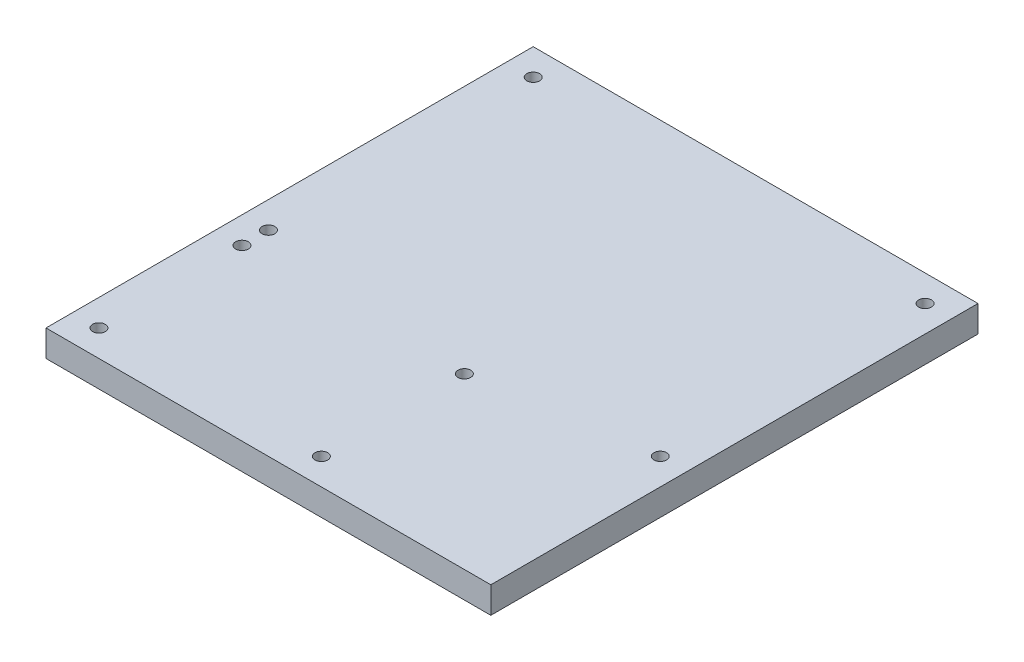
ISO-10303-21;
HEADER;
FILE_DESCRIPTION(('STEP AP214'),'2;1');
FILE_NAME('part.step','',(''),(''),'','','');
FILE_SCHEMA(('AUTOMOTIVE_DESIGN { 1 0 10303 214 1 1 1 1 }'));
ENDSEC;
DATA;
#1=APPLICATION_CONTEXT('core data for automotive mechanical design processes');
#2=APPLICATION_PROTOCOL_DEFINITION('international standard','automotive_design',2000,#1);
#3=PRODUCT_CONTEXT('',#1,'mechanical');
#4=PRODUCT('Part','Part','',(#3));
#5=PRODUCT_RELATED_PRODUCT_CATEGORY('part','',(#4));
#6=PRODUCT_DEFINITION_FORMATION('','',#4);
#7=PRODUCT_DEFINITION_CONTEXT('part definition',#1,'design');
#8=PRODUCT_DEFINITION('design','',#6,#7);
#9=PRODUCT_DEFINITION_SHAPE('','',#8);
#10=(LENGTH_UNIT() NAMED_UNIT(*) SI_UNIT(.MILLI.,.METRE.));
#11=(NAMED_UNIT(*) PLANE_ANGLE_UNIT() SI_UNIT($,.RADIAN.));
#12=(NAMED_UNIT(*) SI_UNIT($,.STERADIAN.) SOLID_ANGLE_UNIT());
#13=UNCERTAINTY_MEASURE_WITH_UNIT(LENGTH_MEASURE(1.E-05),#10,'distance_accuracy_value','');
#14=(GEOMETRIC_REPRESENTATION_CONTEXT(3) GLOBAL_UNCERTAINTY_ASSIGNED_CONTEXT((#13)) GLOBAL_UNIT_ASSIGNED_CONTEXT((#10,
#11,#12)) REPRESENTATION_CONTEXT('',''));
#15=CARTESIAN_POINT('',(0.,0.,0.));
#16=DIRECTION('',(0.,0.,1.));
#17=DIRECTION('',(1.,0.,0.));
#18=AXIS2_PLACEMENT_3D('',#15,#16,#17);
#19=CARTESIAN_POINT('',(42.,5.,-46.));
#20=DIRECTION('',(-1.,0.,0.));
#21=DIRECTION('',(0.,0.,1.));
#22=AXIS2_PLACEMENT_3D('',#19,#20,#21);
#23=PLANE('',#22);
#24=DIRECTION('',(0.,0.,-1.));
#25=VECTOR('',#24,1.);
#26=CARTESIAN_POINT('',(42.,0.,-46.));
#27=LINE('',#26,#25);
#28=CARTESIAN_POINT('',(42.,0.,46.));
#29=VERTEX_POINT('',#28);
#30=CARTESIAN_POINT('',(42.,0.,-46.));
#31=VERTEX_POINT('',#30);
#32=EDGE_CURVE('E265',#29,#31,#27,.T.);
#33=ORIENTED_EDGE('',*,*,#32,.T.);
#34=DIRECTION('',(0.,-1.,0.));
#35=VECTOR('',#34,1.);
#36=CARTESIAN_POINT('',(42.,5.,-46.));
#37=LINE('',#36,#35);
#38=CARTESIAN_POINT('',(42.,5.,-46.));
#39=VERTEX_POINT('',#38);
#40=EDGE_CURVE('E12',#39,#31,#37,.T.);
#41=ORIENTED_EDGE('',*,*,#40,.F.);
#42=DIRECTION('',(0.,0.,-1.));
#43=VECTOR('',#42,1.);
#44=CARTESIAN_POINT('',(42.,5.,-46.));
#45=LINE('',#44,#43);
#46=CARTESIAN_POINT('',(42.,5.,46.));
#47=VERTEX_POINT('',#46);
#48=EDGE_CURVE('E276',#47,#39,#45,.T.);
#49=ORIENTED_EDGE('',*,*,#48,.F.);
#50=DIRECTION('',(0.,-1.,0.));
#51=VECTOR('',#50,1.);
#52=CARTESIAN_POINT('',(42.,5.,46.));
#53=LINE('',#52,#51);
#54=EDGE_CURVE('E286',#47,#29,#53,.T.);
#55=ORIENTED_EDGE('',*,*,#54,.T.);
#56=EDGE_LOOP('',(#33,#41,#49,#55));
#57=FACE_BOUND('',#56,.T.);
#58=ADVANCED_FACE('F59',(#57),#23,.F.);
#59=CARTESIAN_POINT('',(-42.,5.,-46.));
#60=DIRECTION('',(0.,0.,1.));
#61=DIRECTION('',(1.,0.,0.));
#62=AXIS2_PLACEMENT_3D('',#59,#60,#61);
#63=PLANE('',#62);
#64=DIRECTION('',(-1.,0.,0.));
#65=VECTOR('',#64,1.);
#66=CARTESIAN_POINT('',(-42.,0.,-46.));
#67=LINE('',#66,#65);
#68=CARTESIAN_POINT('',(-42.,0.,-46.));
#69=VERTEX_POINT('',#68);
#70=EDGE_CURVE('E289',#31,#69,#67,.T.);
#71=ORIENTED_EDGE('',*,*,#70,.T.);
#72=DIRECTION('',(0.,-1.,0.));
#73=VECTOR('',#72,1.);
#74=CARTESIAN_POINT('',(-42.,5.,-46.));
#75=LINE('',#74,#73);
#76=CARTESIAN_POINT('',(-42.,5.,-46.));
#77=VERTEX_POINT('',#76);
#78=EDGE_CURVE('E67',#77,#69,#75,.T.);
#79=ORIENTED_EDGE('',*,*,#78,.F.);
#80=DIRECTION('',(-1.,0.,0.));
#81=VECTOR('',#80,1.);
#82=CARTESIAN_POINT('',(-42.,5.,-46.));
#83=LINE('',#82,#81);
#84=EDGE_CURVE('E279',#39,#77,#83,.T.);
#85=ORIENTED_EDGE('',*,*,#84,.F.);
#86=ORIENTED_EDGE('',*,*,#40,.T.);
#87=EDGE_LOOP('',(#71,#79,#85,#86));
#88=FACE_BOUND('',#87,.T.);
#89=ADVANCED_FACE('F381',(#88),#63,.F.);
#90=CARTESIAN_POINT('',(-42.,5.,-46.));
#91=DIRECTION('',(1.,0.,0.));
#92=DIRECTION('',(0.,0.,-1.));
#93=AXIS2_PLACEMENT_3D('',#90,#91,#92);
#94=PLANE('',#93);
#95=DIRECTION('',(0.,0.,1.));
#96=VECTOR('',#95,1.);
#97=CARTESIAN_POINT('',(-42.,0.,-46.));
#98=LINE('',#97,#96);
#99=CARTESIAN_POINT('',(-42.,0.,46.));
#100=VERTEX_POINT('',#99);
#101=EDGE_CURVE('E291',#69,#100,#98,.T.);
#102=ORIENTED_EDGE('',*,*,#101,.T.);
#103=DIRECTION('',(0.,-1.,0.));
#104=VECTOR('',#103,1.);
#105=CARTESIAN_POINT('',(-42.,5.,46.));
#106=LINE('',#105,#104);
#107=CARTESIAN_POINT('',(-42.,5.,46.));
#108=VERTEX_POINT('',#107);
#109=EDGE_CURVE('E296',#108,#100,#106,.T.);
#110=ORIENTED_EDGE('',*,*,#109,.F.);
#111=DIRECTION('',(0.,0.,1.));
#112=VECTOR('',#111,1.);
#113=CARTESIAN_POINT('',(-42.,5.,-46.));
#114=LINE('',#113,#112);
#115=EDGE_CURVE('E282',#77,#108,#114,.T.);
#116=ORIENTED_EDGE('',*,*,#115,.F.);
#117=ORIENTED_EDGE('',*,*,#78,.T.);
#118=EDGE_LOOP('',(#102,#110,#116,#117));
#119=FACE_BOUND('',#118,.T.);
#120=ADVANCED_FACE('F386',(#119),#94,.F.);
#121=CARTESIAN_POINT('',(-42.,5.,46.));
#122=DIRECTION('',(0.,0.,-1.));
#123=DIRECTION('',(-1.,0.,0.));
#124=AXIS2_PLACEMENT_3D('',#121,#122,#123);
#125=PLANE('',#124);
#126=DIRECTION('',(1.,0.,0.));
#127=VECTOR('',#126,1.);
#128=CARTESIAN_POINT('',(-42.,0.,46.));
#129=LINE('',#128,#127);
#130=EDGE_CURVE('E280',#100,#29,#129,.T.);
#131=ORIENTED_EDGE('',*,*,#130,.T.);
#132=ORIENTED_EDGE('',*,*,#54,.F.);
#133=DIRECTION('',(1.,0.,0.));
#134=VECTOR('',#133,1.);
#135=CARTESIAN_POINT('',(-42.,5.,46.));
#136=LINE('',#135,#134);
#137=EDGE_CURVE('E284',#108,#47,#136,.T.);
#138=ORIENTED_EDGE('',*,*,#137,.F.);
#139=ORIENTED_EDGE('',*,*,#109,.T.);
#140=EDGE_LOOP('',(#131,#132,#138,#139));
#141=FACE_BOUND('',#140,.T.);
#142=ADVANCED_FACE('F358',(#141),#125,.F.);
#143=CARTESIAN_POINT('',(0.,5.,0.));
#144=DIRECTION('',(0.,1.,0.));
#145=DIRECTION('',(0.,0.,1.));
#146=AXIS2_PLACEMENT_3D('',#143,#144,#145);
#147=PLANE('',#146);
#148=CARTESIAN_POINT('',(4.99999999999999,5.,14.));
#149=DIRECTION('',(0.,1.,0.));
#150=DIRECTION('',(0.,0.,1.));
#151=AXIS2_PLACEMENT_3D('',#148,#149,#150);
#152=CIRCLE('',#151,1.2);
#153=CARTESIAN_POINT('',(4.99999999999999,5.,15.2));
#154=VERTEX_POINT('',#153);
#155=EDGE_CURVE('E308',#154,#154,#152,.T.);
#156=ORIENTED_EDGE('',*,*,#155,.F.);
#157=EDGE_LOOP('',(#156));
#158=FACE_BOUND('',#157,.T.);
#159=CARTESIAN_POINT('',(-37.,5.,41.));
#160=DIRECTION('',(0.,1.,0.));
#161=DIRECTION('',(0.,0.,1.));
#162=AXIS2_PLACEMENT_3D('',#159,#160,#161);
#163=CIRCLE('',#162,1.2);
#164=CARTESIAN_POINT('',(-37.,5.,42.2));
#165=VERTEX_POINT('',#164);
#166=EDGE_CURVE('E345',#165,#165,#163,.T.);
#167=ORIENTED_EDGE('',*,*,#166,.F.);
#168=EDGE_LOOP('',(#167));
#169=FACE_BOUND('',#168,.T.);
#170=CARTESIAN_POINT('',(4.99999999999999,5.,41.));
#171=DIRECTION('',(0.,1.,0.));
#172=DIRECTION('',(0.,0.,1.));
#173=AXIS2_PLACEMENT_3D('',#170,#171,#172);
#174=CIRCLE('',#173,1.2);
#175=CARTESIAN_POINT('',(4.99999999999999,5.,42.2));
#176=VERTEX_POINT('',#175);
#177=EDGE_CURVE('E342',#176,#176,#174,.T.);
#178=ORIENTED_EDGE('',*,*,#177,.F.);
#179=EDGE_LOOP('',(#178));
#180=FACE_BOUND('',#179,.T.);
#181=CARTESIAN_POINT('',(37.,5.,8.99999999999999));
#182=DIRECTION('',(0.,1.,0.));
#183=DIRECTION('',(0.,0.,1.));
#184=AXIS2_PLACEMENT_3D('',#181,#182,#183);
#185=CIRCLE('',#184,1.2);
#186=CARTESIAN_POINT('',(37.,5.,10.2));
#187=VERTEX_POINT('',#186);
#188=EDGE_CURVE('E339',#187,#187,#185,.T.);
#189=ORIENTED_EDGE('',*,*,#188,.F.);
#190=EDGE_LOOP('',(#189));
#191=FACE_BOUND('',#190,.T.);
#192=CARTESIAN_POINT('',(-37.,5.,9.));
#193=DIRECTION('',(0.,1.,0.));
#194=DIRECTION('',(0.,0.,1.));
#195=AXIS2_PLACEMENT_3D('',#192,#193,#194);
#196=CIRCLE('',#195,1.2);
#197=CARTESIAN_POINT('',(-37.,5.,10.2));
#198=VERTEX_POINT('',#197);
#199=EDGE_CURVE('E336',#198,#198,#196,.T.);
#200=ORIENTED_EDGE('',*,*,#199,.F.);
#201=EDGE_LOOP('',(#200));
#202=FACE_BOUND('',#201,.T.);
#203=CARTESIAN_POINT('',(-37.,5.,-41.));
#204=DIRECTION('',(0.,1.,0.));
#205=DIRECTION('',(0.,0.,1.));
#206=AXIS2_PLACEMENT_3D('',#203,#204,#205);
#207=CIRCLE('',#206,1.2);
#208=CARTESIAN_POINT('',(-37.,5.,-39.8));
#209=VERTEX_POINT('',#208);
#210=EDGE_CURVE('E333',#209,#209,#207,.T.);
#211=ORIENTED_EDGE('',*,*,#210,.F.);
#212=EDGE_LOOP('',(#211));
#213=FACE_BOUND('',#212,.T.);
#214=CARTESIAN_POINT('',(37.,5.,-41.));
#215=DIRECTION('',(0.,1.,0.));
#216=DIRECTION('',(0.,0.,1.));
#217=AXIS2_PLACEMENT_3D('',#214,#215,#216);
#218=CIRCLE('',#217,1.2);
#219=CARTESIAN_POINT('',(37.,5.,-39.8));
#220=VERTEX_POINT('',#219);
#221=EDGE_CURVE('E330',#220,#220,#218,.T.);
#222=ORIENTED_EDGE('',*,*,#221,.F.);
#223=EDGE_LOOP('',(#222));
#224=FACE_BOUND('',#223,.T.);
#225=CARTESIAN_POINT('',(-37.,5.,14.));
#226=DIRECTION('',(0.,1.,0.));
#227=DIRECTION('',(0.,0.,1.));
#228=AXIS2_PLACEMENT_3D('',#225,#226,#227);
#229=CIRCLE('',#228,1.2);
#230=CARTESIAN_POINT('',(-37.,5.,15.2));
#231=VERTEX_POINT('',#230);
#232=EDGE_CURVE('E303',#231,#231,#229,.T.);
#233=ORIENTED_EDGE('',*,*,#232,.F.);
#234=EDGE_LOOP('',(#233));
#235=FACE_BOUND('',#234,.T.);
#236=ORIENTED_EDGE('',*,*,#48,.T.);
#237=ORIENTED_EDGE('',*,*,#84,.T.);
#238=ORIENTED_EDGE('',*,*,#115,.T.);
#239=ORIENTED_EDGE('',*,*,#137,.T.);
#240=EDGE_LOOP('',(#236,#237,#238,#239));
#241=FACE_BOUND('',#240,.T.);
#242=ADVANCED_FACE('F354',(#158,#169,#180,#191,#202,#213,#224,#235,#241),#147,.T.);
#243=CARTESIAN_POINT('',(0.,0.,0.));
#244=DIRECTION('',(0.,1.,0.));
#245=DIRECTION('',(0.,0.,1.));
#246=AXIS2_PLACEMENT_3D('',#243,#244,#245);
#247=PLANE('',#246);
#248=CARTESIAN_POINT('',(4.99999999999999,0.,14.));
#249=DIRECTION('',(0.,1.,0.));
#250=DIRECTION('',(0.,0.,1.));
#251=AXIS2_PLACEMENT_3D('',#248,#249,#250);
#252=CIRCLE('',#251,1.2);
#253=CARTESIAN_POINT('',(4.99999999999999,0.,15.2));
#254=VERTEX_POINT('',#253);
#255=EDGE_CURVE('E62',#254,#254,#252,.T.);
#256=ORIENTED_EDGE('',*,*,#255,.T.);
#257=EDGE_LOOP('',(#256));
#258=FACE_BOUND('',#257,.T.);
#259=CARTESIAN_POINT('',(-37.,0.,41.));
#260=DIRECTION('',(0.,1.,0.));
#261=DIRECTION('',(0.,0.,1.));
#262=AXIS2_PLACEMENT_3D('',#259,#260,#261);
#263=CIRCLE('',#262,1.2);
#264=CARTESIAN_POINT('',(-37.,0.,42.2));
#265=VERTEX_POINT('',#264);
#266=EDGE_CURVE('E319',#265,#265,#263,.T.);
#267=ORIENTED_EDGE('',*,*,#266,.T.);
#268=EDGE_LOOP('',(#267));
#269=FACE_BOUND('',#268,.T.);
#270=CARTESIAN_POINT('',(4.99999999999999,0.,41.));
#271=DIRECTION('',(0.,1.,0.));
#272=DIRECTION('',(0.,0.,1.));
#273=AXIS2_PLACEMENT_3D('',#270,#271,#272);
#274=CIRCLE('',#273,1.2);
#275=CARTESIAN_POINT('',(4.99999999999999,0.,42.2));
#276=VERTEX_POINT('',#275);
#277=EDGE_CURVE('E317',#276,#276,#274,.T.);
#278=ORIENTED_EDGE('',*,*,#277,.T.);
#279=EDGE_LOOP('',(#278));
#280=FACE_BOUND('',#279,.T.);
#281=CARTESIAN_POINT('',(37.,0.,8.99999999999999));
#282=DIRECTION('',(0.,1.,0.));
#283=DIRECTION('',(0.,0.,1.));
#284=AXIS2_PLACEMENT_3D('',#281,#282,#283);
#285=CIRCLE('',#284,1.2);
#286=CARTESIAN_POINT('',(37.,0.,10.2));
#287=VERTEX_POINT('',#286);
#288=EDGE_CURVE('E314',#287,#287,#285,.T.);
#289=ORIENTED_EDGE('',*,*,#288,.T.);
#290=EDGE_LOOP('',(#289));
#291=FACE_BOUND('',#290,.T.);
#292=CARTESIAN_POINT('',(-37.,0.,9.));
#293=DIRECTION('',(0.,1.,0.));
#294=DIRECTION('',(0.,0.,1.));
#295=AXIS2_PLACEMENT_3D('',#292,#293,#294);
#296=CIRCLE('',#295,1.2);
#297=CARTESIAN_POINT('',(-37.,0.,10.2));
#298=VERTEX_POINT('',#297);
#299=EDGE_CURVE('E311',#298,#298,#296,.T.);
#300=ORIENTED_EDGE('',*,*,#299,.T.);
#301=EDGE_LOOP('',(#300));
#302=FACE_BOUND('',#301,.T.);
#303=CARTESIAN_POINT('',(-37.,0.,-41.));
#304=DIRECTION('',(0.,1.,0.));
#305=DIRECTION('',(0.,0.,1.));
#306=AXIS2_PLACEMENT_3D('',#303,#304,#305);
#307=CIRCLE('',#306,1.2);
#308=CARTESIAN_POINT('',(-37.,0.,-39.8));
#309=VERTEX_POINT('',#308);
#310=EDGE_CURVE('E307',#309,#309,#307,.T.);
#311=ORIENTED_EDGE('',*,*,#310,.T.);
#312=EDGE_LOOP('',(#311));
#313=FACE_BOUND('',#312,.T.);
#314=CARTESIAN_POINT('',(37.,0.,-41.));
#315=DIRECTION('',(0.,1.,0.));
#316=DIRECTION('',(0.,0.,1.));
#317=AXIS2_PLACEMENT_3D('',#314,#315,#316);
#318=CIRCLE('',#317,1.2);
#319=CARTESIAN_POINT('',(37.,0.,-39.8));
#320=VERTEX_POINT('',#319);
#321=EDGE_CURVE('E304',#320,#320,#318,.T.);
#322=ORIENTED_EDGE('',*,*,#321,.T.);
#323=EDGE_LOOP('',(#322));
#324=FACE_BOUND('',#323,.T.);
#325=CARTESIAN_POINT('',(-37.,0.,14.));
#326=DIRECTION('',(0.,1.,0.));
#327=DIRECTION('',(0.,0.,1.));
#328=AXIS2_PLACEMENT_3D('',#325,#326,#327);
#329=CIRCLE('',#328,1.2);
#330=CARTESIAN_POINT('',(-37.,0.,15.2));
#331=VERTEX_POINT('',#330);
#332=EDGE_CURVE('E202',#331,#331,#329,.T.);
#333=ORIENTED_EDGE('',*,*,#332,.T.);
#334=EDGE_LOOP('',(#333));
#335=FACE_BOUND('',#334,.T.);
#336=DIRECTION('',(-1.,0.,0.));
#337=VECTOR('',#336,1.);
#338=CARTESIAN_POINT('',(0.,0.,-12.5));
#339=LINE('',#338,#337);
#340=CARTESIAN_POINT('',(12.5,0.,-12.5));
#341=VERTEX_POINT('',#340);
#342=CARTESIAN_POINT('',(-12.5,0.,-12.5));
#343=VERTEX_POINT('',#342);
#344=EDGE_CURVE('E236',#341,#343,#339,.T.);
#345=ORIENTED_EDGE('',*,*,#344,.T.);
#346=DIRECTION('',(0.,0.,1.));
#347=VECTOR('',#346,1.);
#348=CARTESIAN_POINT('',(-12.5,0.,0.));
#349=LINE('',#348,#347);
#350=CARTESIAN_POINT('',(-12.5,0.,12.5));
#351=VERTEX_POINT('',#350);
#352=EDGE_CURVE('E180',#343,#351,#349,.T.);
#353=ORIENTED_EDGE('',*,*,#352,.T.);
#354=DIRECTION('',(-1.,0.,0.));
#355=VECTOR('',#354,1.);
#356=CARTESIAN_POINT('',(0.,0.,12.5));
#357=LINE('',#356,#355);
#358=CARTESIAN_POINT('',(12.5,0.,12.5));
#359=VERTEX_POINT('',#358);
#360=EDGE_CURVE('E241',#359,#351,#357,.T.);
#361=ORIENTED_EDGE('',*,*,#360,.F.);
#362=DIRECTION('',(0.,0.,1.));
#363=VECTOR('',#362,1.);
#364=CARTESIAN_POINT('',(12.5,0.,0.));
#365=LINE('',#364,#363);
#366=EDGE_CURVE('E238',#341,#359,#365,.T.);
#367=ORIENTED_EDGE('',*,*,#366,.F.);
#368=EDGE_LOOP('',(#345,#353,#361,#367));
#369=FACE_BOUND('',#368,.T.);
#370=ORIENTED_EDGE('',*,*,#32,.F.);
#371=ORIENTED_EDGE('',*,*,#130,.F.);
#372=ORIENTED_EDGE('',*,*,#101,.F.);
#373=ORIENTED_EDGE('',*,*,#70,.F.);
#374=EDGE_LOOP('',(#370,#371,#372,#373));
#375=FACE_BOUND('',#374,.T.);
#376=ADVANCED_FACE('F357',(#258,#269,#280,#291,#302,#313,#324,#335,#369,#375),#247,.F.);
#377=CARTESIAN_POINT('',(0.,-10.,7.49999999999999));
#378=DIRECTION('',(0.,0.,1.));
#379=DIRECTION('',(1.,0.,0.));
#380=AXIS2_PLACEMENT_3D('',#377,#378,#379);
#381=PLANE('',#380);
#382=DIRECTION('',(1.,0.,0.));
#383=VECTOR('',#382,1.);
#384=CARTESIAN_POINT('',(0.,0.,7.49999999999999));
#385=LINE('',#384,#383);
#386=CARTESIAN_POINT('',(-7.5,0.,7.49999999999999));
#387=VERTEX_POINT('',#386);
#388=CARTESIAN_POINT('',(7.5,0.,7.49999999999999));
#389=VERTEX_POINT('',#388);
#390=EDGE_CURVE('E244',#387,#389,#385,.T.);
#391=ORIENTED_EDGE('',*,*,#390,.T.);
#392=DIRECTION('',(0.,1.,0.));
#393=VECTOR('',#392,1.);
#394=CARTESIAN_POINT('',(7.5,-10.,7.49999999999999));
#395=LINE('',#394,#393);
#396=CARTESIAN_POINT('',(7.5,-10.,7.49999999999999));
#397=VERTEX_POINT('',#396);
#398=EDGE_CURVE('E263',#397,#389,#395,.T.);
#399=ORIENTED_EDGE('',*,*,#398,.F.);
#400=DIRECTION('',(1.,0.,0.));
#401=VECTOR('',#400,1.);
#402=CARTESIAN_POINT('',(0.,-10.,7.49999999999999));
#403=LINE('',#402,#401);
#404=CARTESIAN_POINT('',(-7.5,-10.,7.49999999999999));
#405=VERTEX_POINT('',#404);
#406=EDGE_CURVE('E223',#405,#397,#403,.T.);
#407=ORIENTED_EDGE('',*,*,#406,.F.);
#408=DIRECTION('',(0.,1.,0.));
#409=VECTOR('',#408,1.);
#410=CARTESIAN_POINT('',(-7.5,-10.,7.49999999999999));
#411=LINE('',#410,#409);
#412=EDGE_CURVE('E255',#405,#387,#411,.T.);
#413=ORIENTED_EDGE('',*,*,#412,.T.);
#414=EDGE_LOOP('',(#391,#399,#407,#413));
#415=FACE_BOUND('',#414,.T.);
#416=ADVANCED_FACE('F391',(#415),#381,.F.);
#417=CARTESIAN_POINT('',(7.5,-10.,0.));
#418=DIRECTION('',(1.,0.,0.));
#419=DIRECTION('',(0.,0.,-1.));
#420=AXIS2_PLACEMENT_3D('',#417,#418,#419);
#421=PLANE('',#420);
#422=DIRECTION('',(0.,0.,-1.));
#423=VECTOR('',#422,1.);
#424=CARTESIAN_POINT('',(7.5,0.,0.));
#425=LINE('',#424,#423);
#426=CARTESIAN_POINT('',(7.5,0.,-7.50000000000001));
#427=VERTEX_POINT('',#426);
#428=EDGE_CURVE('E247',#389,#427,#425,.T.);
#429=ORIENTED_EDGE('',*,*,#428,.T.);
#430=DIRECTION('',(0.,1.,0.));
#431=VECTOR('',#430,1.);
#432=CARTESIAN_POINT('',(7.5,-10.,-7.50000000000001));
#433=LINE('',#432,#431);
#434=CARTESIAN_POINT('',(7.5,-10.,-7.50000000000001));
#435=VERTEX_POINT('',#434);
#436=EDGE_CURVE('E261',#435,#427,#433,.T.);
#437=ORIENTED_EDGE('',*,*,#436,.F.);
#438=DIRECTION('',(0.,0.,-1.));
#439=VECTOR('',#438,1.);
#440=CARTESIAN_POINT('',(7.5,-10.,0.));
#441=LINE('',#440,#439);
#442=EDGE_CURVE('E226',#397,#435,#441,.T.);
#443=ORIENTED_EDGE('',*,*,#442,.F.);
#444=ORIENTED_EDGE('',*,*,#398,.T.);
#445=EDGE_LOOP('',(#429,#437,#443,#444));
#446=FACE_BOUND('',#445,.T.);
#447=ADVANCED_FACE('F397',(#446),#421,.F.);
#448=CARTESIAN_POINT('',(0.,-10.,-7.50000000000001));
#449=DIRECTION('',(0.,0.,1.));
#450=DIRECTION('',(1.,0.,0.));
#451=AXIS2_PLACEMENT_3D('',#448,#449,#450);
#452=PLANE('',#451);
#453=DIRECTION('',(1.,0.,0.));
#454=VECTOR('',#453,1.);
#455=CARTESIAN_POINT('',(0.,0.,-7.50000000000001));
#456=LINE('',#455,#454);
#457=CARTESIAN_POINT('',(-7.5,0.,-7.50000000000001));
#458=VERTEX_POINT('',#457);
#459=EDGE_CURVE('E250',#458,#427,#456,.T.);
#460=ORIENTED_EDGE('',*,*,#459,.F.);
#461=DIRECTION('',(0.,1.,0.));
#462=VECTOR('',#461,1.);
#463=CARTESIAN_POINT('',(-7.5,-10.,-7.50000000000001));
#464=LINE('',#463,#462);
#465=CARTESIAN_POINT('',(-7.5,-10.,-7.50000000000001));
#466=VERTEX_POINT('',#465);
#467=EDGE_CURVE('E257',#466,#458,#464,.T.);
#468=ORIENTED_EDGE('',*,*,#467,.F.);
#469=DIRECTION('',(1.,0.,0.));
#470=VECTOR('',#469,1.);
#471=CARTESIAN_POINT('',(0.,-10.,-7.50000000000001));
#472=LINE('',#471,#470);
#473=EDGE_CURVE('E228',#466,#435,#472,.T.);
#474=ORIENTED_EDGE('',*,*,#473,.T.);
#475=ORIENTED_EDGE('',*,*,#436,.T.);
#476=EDGE_LOOP('',(#460,#468,#474,#475));
#477=FACE_BOUND('',#476,.T.);
#478=ADVANCED_FACE('F534',(#477),#452,.T.);
#479=CARTESIAN_POINT('',(-12.5,-10.,0.));
#480=DIRECTION('',(-1.,0.,0.));
#481=DIRECTION('',(0.,0.,1.));
#482=AXIS2_PLACEMENT_3D('',#479,#480,#481);
#483=PLANE('',#482);
#484=ORIENTED_EDGE('',*,*,#352,.F.);
#485=DIRECTION('',(0.,1.,0.));
#486=VECTOR('',#485,1.);
#487=CARTESIAN_POINT('',(-12.5,-10.,-12.5));
#488=LINE('',#487,#486);
#489=CARTESIAN_POINT('',(-12.5,-10.,-12.5));
#490=VERTEX_POINT('',#489);
#491=EDGE_CURVE('E258',#490,#343,#488,.T.);
#492=ORIENTED_EDGE('',*,*,#491,.F.);
#493=DIRECTION('',(0.,0.,1.));
#494=VECTOR('',#493,1.);
#495=CARTESIAN_POINT('',(-12.5,-10.,0.));
#496=LINE('',#495,#494);
#497=CARTESIAN_POINT('',(-12.5,-10.,12.5));
#498=VERTEX_POINT('',#497);
#499=EDGE_CURVE('E212',#490,#498,#496,.T.);
#500=ORIENTED_EDGE('',*,*,#499,.T.);
#501=DIRECTION('',(0.,1.,0.));
#502=VECTOR('',#501,1.);
#503=CARTESIAN_POINT('',(-12.5,-10.,12.5));
#504=LINE('',#503,#502);
#505=EDGE_CURVE('E234',#498,#351,#504,.T.);
#506=ORIENTED_EDGE('',*,*,#505,.T.);
#507=EDGE_LOOP('',(#484,#492,#500,#506));
#508=FACE_BOUND('',#507,.T.);
#509=ADVANCED_FACE('F537',(#508),#483,.T.);
#510=CARTESIAN_POINT('',(0.,-10.,-12.5));
#511=DIRECTION('',(0.,0.,-1.));
#512=DIRECTION('',(-1.,0.,0.));
#513=AXIS2_PLACEMENT_3D('',#510,#511,#512);
#514=PLANE('',#513);
#515=ORIENTED_EDGE('',*,*,#344,.F.);
#516=DIRECTION('',(0.,1.,0.));
#517=VECTOR('',#516,1.);
#518=CARTESIAN_POINT('',(12.5,-10.,-12.5));
#519=LINE('',#518,#517);
#520=CARTESIAN_POINT('',(12.5,-10.,-12.5));
#521=VERTEX_POINT('',#520);
#522=EDGE_CURVE('E271',#521,#341,#519,.T.);
#523=ORIENTED_EDGE('',*,*,#522,.F.);
#524=DIRECTION('',(-1.,0.,0.));
#525=VECTOR('',#524,1.);
#526=CARTESIAN_POINT('',(0.,-10.,-12.5));
#527=LINE('',#526,#525);
#528=EDGE_CURVE('E215',#521,#490,#527,.T.);
#529=ORIENTED_EDGE('',*,*,#528,.T.);
#530=ORIENTED_EDGE('',*,*,#491,.T.);
#531=EDGE_LOOP('',(#515,#523,#529,#530));
#532=FACE_BOUND('',#531,.T.);
#533=ADVANCED_FACE('F548',(#532),#514,.T.);
#534=CARTESIAN_POINT('',(12.5,-10.,0.));
#535=DIRECTION('',(-1.,0.,0.));
#536=DIRECTION('',(0.,0.,1.));
#537=AXIS2_PLACEMENT_3D('',#534,#535,#536);
#538=PLANE('',#537);
#539=ORIENTED_EDGE('',*,*,#366,.T.);
#540=DIRECTION('',(0.,1.,0.));
#541=VECTOR('',#540,1.);
#542=CARTESIAN_POINT('',(12.5,-10.,12.5));
#543=LINE('',#542,#541);
#544=CARTESIAN_POINT('',(12.5,-10.,12.5));
#545=VERTEX_POINT('',#544);
#546=EDGE_CURVE('E268',#545,#359,#543,.T.);
#547=ORIENTED_EDGE('',*,*,#546,.F.);
#548=DIRECTION('',(0.,0.,1.));
#549=VECTOR('',#548,1.);
#550=CARTESIAN_POINT('',(12.5,-10.,0.));
#551=LINE('',#550,#549);
#552=EDGE_CURVE('E219',#521,#545,#551,.T.);
#553=ORIENTED_EDGE('',*,*,#552,.F.);
#554=ORIENTED_EDGE('',*,*,#522,.T.);
#555=EDGE_LOOP('',(#539,#547,#553,#554));
#556=FACE_BOUND('',#555,.T.);
#557=ADVANCED_FACE('F544',(#556),#538,.F.);
#558=CARTESIAN_POINT('',(0.,-10.,12.5));
#559=DIRECTION('',(0.,0.,-1.));
#560=DIRECTION('',(-1.,0.,0.));
#561=AXIS2_PLACEMENT_3D('',#558,#559,#560);
#562=PLANE('',#561);
#563=ORIENTED_EDGE('',*,*,#360,.T.);
#564=ORIENTED_EDGE('',*,*,#505,.F.);
#565=DIRECTION('',(-1.,0.,0.));
#566=VECTOR('',#565,1.);
#567=CARTESIAN_POINT('',(0.,-10.,12.5));
#568=LINE('',#567,#566);
#569=EDGE_CURVE('E221',#545,#498,#568,.T.);
#570=ORIENTED_EDGE('',*,*,#569,.F.);
#571=ORIENTED_EDGE('',*,*,#546,.T.);
#572=EDGE_LOOP('',(#563,#564,#570,#571));
#573=FACE_BOUND('',#572,.T.);
#574=ADVANCED_FACE('F532',(#573),#562,.F.);
#575=CARTESIAN_POINT('',(-7.5,-10.,0.));
#576=DIRECTION('',(1.,0.,0.));
#577=DIRECTION('',(0.,0.,-1.));
#578=AXIS2_PLACEMENT_3D('',#575,#576,#577);
#579=PLANE('',#578);
#580=DIRECTION('',(0.,0.,-1.));
#581=VECTOR('',#580,1.);
#582=CARTESIAN_POINT('',(-7.5,0.,0.));
#583=LINE('',#582,#581);
#584=EDGE_CURVE('E216',#387,#458,#583,.T.);
#585=ORIENTED_EDGE('',*,*,#584,.F.);
#586=ORIENTED_EDGE('',*,*,#412,.F.);
#587=DIRECTION('',(0.,0.,-1.));
#588=VECTOR('',#587,1.);
#589=CARTESIAN_POINT('',(-7.5,-10.,0.));
#590=LINE('',#589,#588);
#591=EDGE_CURVE('E231',#405,#466,#590,.T.);
#592=ORIENTED_EDGE('',*,*,#591,.T.);
#593=ORIENTED_EDGE('',*,*,#467,.T.);
#594=EDGE_LOOP('',(#585,#586,#592,#593));
#595=FACE_BOUND('',#594,.T.);
#596=ADVANCED_FACE('F528',(#595),#579,.T.);
#597=CARTESIAN_POINT('',(0.,-10.,0.));
#598=DIRECTION('',(0.,-1.,0.));
#599=DIRECTION('',(0.,0.,-1.));
#600=AXIS2_PLACEMENT_3D('',#597,#598,#599);
#601=PLANE('',#600);
#602=ORIENTED_EDGE('',*,*,#499,.F.);
#603=ORIENTED_EDGE('',*,*,#528,.F.);
#604=ORIENTED_EDGE('',*,*,#552,.T.);
#605=ORIENTED_EDGE('',*,*,#569,.T.);
#606=EDGE_LOOP('',(#602,#603,#604,#605));
#607=FACE_BOUND('',#606,.T.);
#608=ORIENTED_EDGE('',*,*,#406,.T.);
#609=ORIENTED_EDGE('',*,*,#442,.T.);
#610=ORIENTED_EDGE('',*,*,#473,.F.);
#611=ORIENTED_EDGE('',*,*,#591,.F.);
#612=EDGE_LOOP('',(#608,#609,#610,#611));
#613=FACE_BOUND('',#612,.T.);
#614=ADVANCED_FACE('F402',(#607,#613),#601,.T.);
#615=DIRECTION('',(1.,0.,0.));
#616=VECTOR('',#615,1.);
#617=CARTESIAN_POINT('',(0.,0.,2.5));
#618=LINE('',#617,#616);
#619=CARTESIAN_POINT('',(-2.55,0.,2.5));
#620=VERTEX_POINT('',#619);
#621=CARTESIAN_POINT('',(2.55,0.,2.5));
#622=VERTEX_POINT('',#621);
#623=EDGE_CURVE('E75',#620,#622,#618,.T.);
#624=ORIENTED_EDGE('',*,*,#623,.T.);
#625=DIRECTION('',(0.,0.,-1.));
#626=VECTOR('',#625,1.);
#627=CARTESIAN_POINT('',(2.55,0.,0.));
#628=LINE('',#627,#626);
#629=CARTESIAN_POINT('',(2.55,0.,-2.5));
#630=VERTEX_POINT('',#629);
#631=EDGE_CURVE('E177',#622,#630,#628,.T.);
#632=ORIENTED_EDGE('',*,*,#631,.T.);
#633=DIRECTION('',(1.,0.,0.));
#634=VECTOR('',#633,1.);
#635=CARTESIAN_POINT('',(0.,0.,-2.5));
#636=LINE('',#635,#634);
#637=CARTESIAN_POINT('',(-2.55,0.,-2.5));
#638=VERTEX_POINT('',#637);
#639=EDGE_CURVE('E190',#638,#630,#636,.T.);
#640=ORIENTED_EDGE('',*,*,#639,.F.);
#641=DIRECTION('',(0.,0.,-1.));
#642=VECTOR('',#641,1.);
#643=CARTESIAN_POINT('',(-2.55,0.,0.));
#644=LINE('',#643,#642);
#645=EDGE_CURVE('E80',#620,#638,#644,.T.);
#646=ORIENTED_EDGE('',*,*,#645,.F.);
#647=EDGE_LOOP('',(#624,#632,#640,#646));
#648=FACE_BOUND('',#647,.T.);
#649=ORIENTED_EDGE('',*,*,#390,.F.);
#650=ORIENTED_EDGE('',*,*,#584,.T.);
#651=ORIENTED_EDGE('',*,*,#459,.T.);
#652=ORIENTED_EDGE('',*,*,#428,.F.);
#653=EDGE_LOOP('',(#649,#650,#651,#652));
#654=FACE_BOUND('',#653,.T.);
#655=ADVANCED_FACE('F393',(#648,#654),#247,.F.);
#656=CARTESIAN_POINT('',(2.55,-10.,0.));
#657=DIRECTION('',(1.,0.,0.));
#658=DIRECTION('',(0.,0.,-1.));
#659=AXIS2_PLACEMENT_3D('',#656,#657,#658);
#660=PLANE('',#659);
#661=ORIENTED_EDGE('',*,*,#631,.F.);
#662=DIRECTION('',(0.,1.,0.));
#663=VECTOR('',#662,1.);
#664=CARTESIAN_POINT('',(2.55,-10.,2.5));
#665=LINE('',#664,#663);
#666=CARTESIAN_POINT('',(2.55,-10.,2.5));
#667=VERTEX_POINT('',#666);
#668=EDGE_CURVE('E172',#667,#622,#665,.T.);
#669=ORIENTED_EDGE('',*,*,#668,.F.);
#670=DIRECTION('',(0.,0.,-1.));
#671=VECTOR('',#670,1.);
#672=CARTESIAN_POINT('',(2.55,-10.,0.));
#673=LINE('',#672,#671);
#674=CARTESIAN_POINT('',(2.55,-10.,-2.5));
#675=VERTEX_POINT('',#674);
#676=EDGE_CURVE('E176',#667,#675,#673,.T.);
#677=ORIENTED_EDGE('',*,*,#676,.T.);
#678=DIRECTION('',(0.,1.,0.));
#679=VECTOR('',#678,1.);
#680=CARTESIAN_POINT('',(2.55,-10.,-2.5));
#681=LINE('',#680,#679);
#682=EDGE_CURVE('E200',#675,#630,#681,.T.);
#683=ORIENTED_EDGE('',*,*,#682,.T.);
#684=EDGE_LOOP('',(#661,#669,#677,#683));
#685=FACE_BOUND('',#684,.T.);
#686=ADVANCED_FACE('F174',(#685),#660,.T.);
#687=CARTESIAN_POINT('',(0.,-10.,2.5));
#688=DIRECTION('',(0.,0.,1.));
#689=DIRECTION('',(1.,0.,0.));
#690=AXIS2_PLACEMENT_3D('',#687,#688,#689);
#691=PLANE('',#690);
#692=ORIENTED_EDGE('',*,*,#623,.F.);
#693=DIRECTION('',(0.,1.,0.));
#694=VECTOR('',#693,1.);
#695=CARTESIAN_POINT('',(-2.55,-10.,2.5));
#696=LINE('',#695,#694);
#697=CARTESIAN_POINT('',(-2.55,-10.,2.5));
#698=VERTEX_POINT('',#697);
#699=EDGE_CURVE('E181',#698,#620,#696,.T.);
#700=ORIENTED_EDGE('',*,*,#699,.F.);
#701=DIRECTION('',(1.,0.,0.));
#702=VECTOR('',#701,1.);
#703=CARTESIAN_POINT('',(0.,-10.,2.5));
#704=LINE('',#703,#702);
#705=EDGE_CURVE('E186',#698,#667,#704,.T.);
#706=ORIENTED_EDGE('',*,*,#705,.T.);
#707=ORIENTED_EDGE('',*,*,#668,.T.);
#708=EDGE_LOOP('',(#692,#700,#706,#707));
#709=FACE_BOUND('',#708,.T.);
#710=ADVANCED_FACE('F192',(#709),#691,.T.);
#711=CARTESIAN_POINT('',(-2.55,-10.,0.));
#712=DIRECTION('',(1.,0.,0.));
#713=DIRECTION('',(0.,0.,-1.));
#714=AXIS2_PLACEMENT_3D('',#711,#712,#713);
#715=PLANE('',#714);
#716=ORIENTED_EDGE('',*,*,#645,.T.);
#717=DIRECTION('',(0.,1.,0.));
#718=VECTOR('',#717,1.);
#719=CARTESIAN_POINT('',(-2.55,-10.,-2.5));
#720=LINE('',#719,#718);
#721=CARTESIAN_POINT('',(-2.55,-10.,-2.5));
#722=VERTEX_POINT('',#721);
#723=EDGE_CURVE('E208',#722,#638,#720,.T.);
#724=ORIENTED_EDGE('',*,*,#723,.F.);
#725=DIRECTION('',(0.,0.,-1.));
#726=VECTOR('',#725,1.);
#727=CARTESIAN_POINT('',(-2.55,-10.,0.));
#728=LINE('',#727,#726);
#729=EDGE_CURVE('E194',#698,#722,#728,.T.);
#730=ORIENTED_EDGE('',*,*,#729,.F.);
#731=ORIENTED_EDGE('',*,*,#699,.T.);
#732=EDGE_LOOP('',(#716,#724,#730,#731));
#733=FACE_BOUND('',#732,.T.);
#734=ADVANCED_FACE('F517',(#733),#715,.F.);
#735=CARTESIAN_POINT('',(0.,-10.,-2.5));
#736=DIRECTION('',(0.,0.,1.));
#737=DIRECTION('',(1.,0.,0.));
#738=AXIS2_PLACEMENT_3D('',#735,#736,#737);
#739=PLANE('',#738);
#740=ORIENTED_EDGE('',*,*,#639,.T.);
#741=ORIENTED_EDGE('',*,*,#682,.F.);
#742=DIRECTION('',(1.,0.,0.));
#743=VECTOR('',#742,1.);
#744=CARTESIAN_POINT('',(0.,-10.,-2.5));
#745=LINE('',#744,#743);
#746=EDGE_CURVE('E188',#722,#675,#745,.T.);
#747=ORIENTED_EDGE('',*,*,#746,.F.);
#748=ORIENTED_EDGE('',*,*,#723,.T.);
#749=EDGE_LOOP('',(#740,#741,#747,#748));
#750=FACE_BOUND('',#749,.T.);
#751=ADVANCED_FACE('F514',(#750),#739,.F.);
#752=CARTESIAN_POINT('',(0.,-10.,0.));
#753=DIRECTION('',(0.,-1.,0.));
#754=DIRECTION('',(0.,0.,-1.));
#755=AXIS2_PLACEMENT_3D('',#752,#753,#754);
#756=PLANE('',#755);
#757=ORIENTED_EDGE('',*,*,#676,.F.);
#758=ORIENTED_EDGE('',*,*,#705,.F.);
#759=ORIENTED_EDGE('',*,*,#729,.T.);
#760=ORIENTED_EDGE('',*,*,#746,.T.);
#761=EDGE_LOOP('',(#757,#758,#759,#760));
#762=FACE_BOUND('',#761,.T.);
#763=ADVANCED_FACE('F185',(#762),#756,.T.);
#764=CARTESIAN_POINT('',(-37.,-5.,14.));
#765=DIRECTION('',(0.,1.,0.));
#766=DIRECTION('',(0.,0.,1.));
#767=AXIS2_PLACEMENT_3D('',#764,#765,#766);
#768=CYLINDRICAL_SURFACE('',#767,1.2);
#769=ORIENTED_EDGE('',*,*,#232,.T.);
#770=EDGE_LOOP('',(#769));
#771=FACE_BOUND('',#770,.T.);
#772=ORIENTED_EDGE('',*,*,#332,.F.);
#773=EDGE_LOOP('',(#772));
#774=FACE_BOUND('',#773,.T.);
#775=ADVANCED_FACE('F436',(#771,#774),#768,.F.);
#776=CARTESIAN_POINT('',(37.,-5.,-41.));
#777=DIRECTION('',(0.,1.,0.));
#778=DIRECTION('',(0.,0.,1.));
#779=AXIS2_PLACEMENT_3D('',#776,#777,#778);
#780=CYLINDRICAL_SURFACE('',#779,1.2);
#781=ORIENTED_EDGE('',*,*,#221,.T.);
#782=EDGE_LOOP('',(#781));
#783=FACE_BOUND('',#782,.T.);
#784=ORIENTED_EDGE('',*,*,#321,.F.);
#785=EDGE_LOOP('',(#784));
#786=FACE_BOUND('',#785,.T.);
#787=ADVANCED_FACE('F441',(#783,#786),#780,.F.);
#788=CARTESIAN_POINT('',(-37.,-5.,-41.));
#789=DIRECTION('',(0.,1.,0.));
#790=DIRECTION('',(0.,0.,1.));
#791=AXIS2_PLACEMENT_3D('',#788,#789,#790);
#792=CYLINDRICAL_SURFACE('',#791,1.2);
#793=ORIENTED_EDGE('',*,*,#210,.T.);
#794=EDGE_LOOP('',(#793));
#795=FACE_BOUND('',#794,.T.);
#796=ORIENTED_EDGE('',*,*,#310,.F.);
#797=EDGE_LOOP('',(#796));
#798=FACE_BOUND('',#797,.T.);
#799=ADVANCED_FACE('F450',(#795,#798),#792,.F.);
#800=CARTESIAN_POINT('',(-37.,-5.,9.));
#801=DIRECTION('',(0.,1.,0.));
#802=DIRECTION('',(0.,0.,1.));
#803=AXIS2_PLACEMENT_3D('',#800,#801,#802);
#804=CYLINDRICAL_SURFACE('',#803,1.2);
#805=ORIENTED_EDGE('',*,*,#199,.T.);
#806=EDGE_LOOP('',(#805));
#807=FACE_BOUND('',#806,.T.);
#808=ORIENTED_EDGE('',*,*,#299,.F.);
#809=EDGE_LOOP('',(#808));
#810=FACE_BOUND('',#809,.T.);
#811=ADVANCED_FACE('F460',(#807,#810),#804,.F.);
#812=CARTESIAN_POINT('',(37.,-5.,8.99999999999999));
#813=DIRECTION('',(0.,1.,0.));
#814=DIRECTION('',(0.,0.,1.));
#815=AXIS2_PLACEMENT_3D('',#812,#813,#814);
#816=CYLINDRICAL_SURFACE('',#815,1.2);
#817=ORIENTED_EDGE('',*,*,#188,.T.);
#818=EDGE_LOOP('',(#817));
#819=FACE_BOUND('',#818,.T.);
#820=ORIENTED_EDGE('',*,*,#288,.F.);
#821=EDGE_LOOP('',(#820));
#822=FACE_BOUND('',#821,.T.);
#823=ADVANCED_FACE('F470',(#819,#822),#816,.F.);
#824=CARTESIAN_POINT('',(4.99999999999999,-5.,41.));
#825=DIRECTION('',(0.,1.,0.));
#826=DIRECTION('',(0.,0.,1.));
#827=AXIS2_PLACEMENT_3D('',#824,#825,#826);
#828=CYLINDRICAL_SURFACE('',#827,1.2);
#829=ORIENTED_EDGE('',*,*,#177,.T.);
#830=EDGE_LOOP('',(#829));
#831=FACE_BOUND('',#830,.T.);
#832=ORIENTED_EDGE('',*,*,#277,.F.);
#833=EDGE_LOOP('',(#832));
#834=FACE_BOUND('',#833,.T.);
#835=ADVANCED_FACE('F480',(#831,#834),#828,.F.);
#836=CARTESIAN_POINT('',(-37.,-5.,41.));
#837=DIRECTION('',(0.,1.,0.));
#838=DIRECTION('',(0.,0.,1.));
#839=AXIS2_PLACEMENT_3D('',#836,#837,#838);
#840=CYLINDRICAL_SURFACE('',#839,1.2);
#841=ORIENTED_EDGE('',*,*,#166,.T.);
#842=EDGE_LOOP('',(#841));
#843=FACE_BOUND('',#842,.T.);
#844=ORIENTED_EDGE('',*,*,#266,.F.);
#845=EDGE_LOOP('',(#844));
#846=FACE_BOUND('',#845,.T.);
#847=ADVANCED_FACE('F490',(#843,#846),#840,.F.);
#848=CARTESIAN_POINT('',(4.99999999999999,-5.,14.));
#849=DIRECTION('',(0.,1.,0.));
#850=DIRECTION('',(0.,0.,1.));
#851=AXIS2_PLACEMENT_3D('',#848,#849,#850);
#852=CYLINDRICAL_SURFACE('',#851,1.2);
#853=ORIENTED_EDGE('',*,*,#155,.T.);
#854=EDGE_LOOP('',(#853));
#855=FACE_BOUND('',#854,.T.);
#856=ORIENTED_EDGE('',*,*,#255,.F.);
#857=EDGE_LOOP('',(#856));
#858=FACE_BOUND('',#857,.T.);
#859=ADVANCED_FACE('F351',(#855,#858),#852,.F.);
#860=CLOSED_SHELL('',(#58,#89,#120,#142,#242,#376,#416,#447,#478,#509,#533,#557,#574,#596,#614,
#655,#686,#710,#734,#751,#763,#775,#787,#799,#811,#823,#835,#847,#859));
#861=MANIFOLD_SOLID_BREP('B2',#860);
#862=ADVANCED_BREP_SHAPE_REPRESENTATION('',(#18,#861),#14);
#863=SHAPE_DEFINITION_REPRESENTATION(#9,#862);
ENDSEC;
END-ISO-10303-21;
